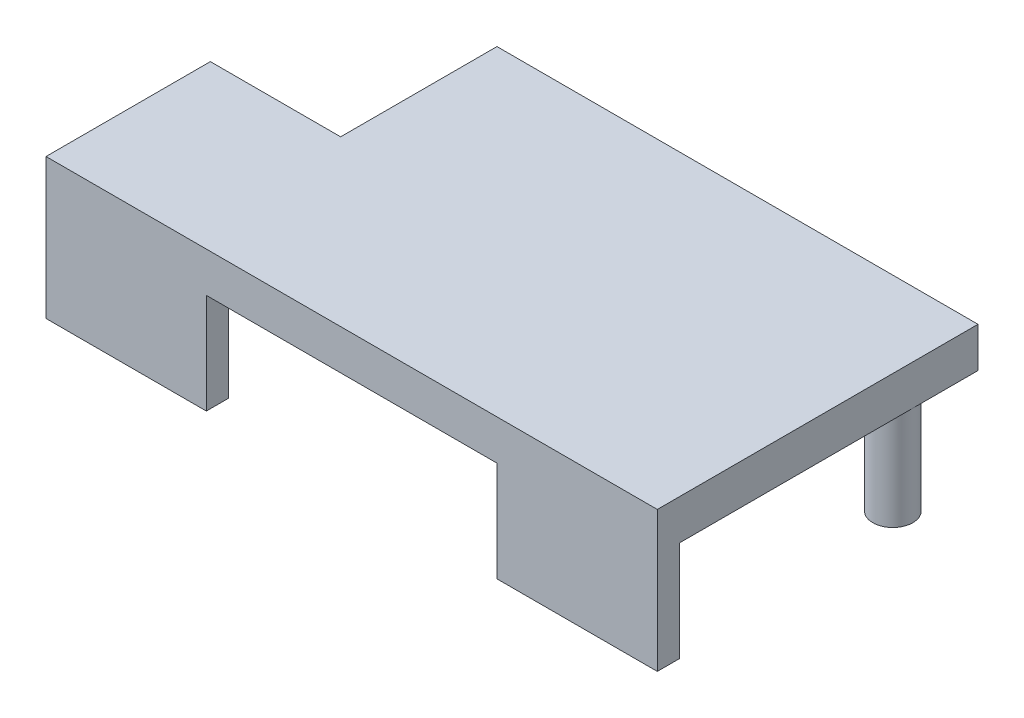
ISO-10303-21;
HEADER;
FILE_DESCRIPTION(('STEP AP214'),'2;1');
FILE_NAME('part.step','',(''),(''),'','','');
FILE_SCHEMA(('AUTOMOTIVE_DESIGN { 1 0 10303 214 1 1 1 1 }'));
ENDSEC;
DATA;
#1=APPLICATION_CONTEXT('core data for automotive mechanical design processes');
#2=APPLICATION_PROTOCOL_DEFINITION('international standard','automotive_design',2000,#1);
#3=PRODUCT_CONTEXT('',#1,'mechanical');
#4=PRODUCT('Part','Part','',(#3));
#5=PRODUCT_RELATED_PRODUCT_CATEGORY('part','',(#4));
#6=PRODUCT_DEFINITION_FORMATION('','',#4);
#7=PRODUCT_DEFINITION_CONTEXT('part definition',#1,'design');
#8=PRODUCT_DEFINITION('design','',#6,#7);
#9=PRODUCT_DEFINITION_SHAPE('','',#8);
#10=(LENGTH_UNIT() NAMED_UNIT(*) SI_UNIT(.MILLI.,.METRE.));
#11=(NAMED_UNIT(*) PLANE_ANGLE_UNIT() SI_UNIT($,.RADIAN.));
#12=(NAMED_UNIT(*) SI_UNIT($,.STERADIAN.) SOLID_ANGLE_UNIT());
#13=UNCERTAINTY_MEASURE_WITH_UNIT(LENGTH_MEASURE(1.E-05),#10,'distance_accuracy_value','');
#14=(GEOMETRIC_REPRESENTATION_CONTEXT(3) GLOBAL_UNCERTAINTY_ASSIGNED_CONTEXT((#13)) GLOBAL_UNIT_ASSIGNED_CONTEXT((#10,
#11,#12)) REPRESENTATION_CONTEXT('',''));
#15=CARTESIAN_POINT('',(0.,0.,0.));
#16=DIRECTION('',(0.,0.,1.));
#17=DIRECTION('',(1.,0.,0.));
#18=AXIS2_PLACEMENT_3D('',#15,#16,#17);
#19=CARTESIAN_POINT('',(-15.25,2.,-8.));
#20=DIRECTION('',(1.,0.,0.));
#21=DIRECTION('',(0.,0.,-1.));
#22=AXIS2_PLACEMENT_3D('',#19,#20,#21);
#23=PLANE('',#22);
#24=DIRECTION('',(0.,0.,-1.));
#25=VECTOR('',#24,1.);
#26=CARTESIAN_POINT('',(-15.25,-5.,8.));
#27=LINE('',#26,#25);
#28=CARTESIAN_POINT('',(-15.25,-5.,8.));
#29=VERTEX_POINT('',#28);
#30=CARTESIAN_POINT('',(-15.25,-5.,6.9));
#31=VERTEX_POINT('',#30);
#32=EDGE_CURVE('E156',#29,#31,#27,.T.);
#33=ORIENTED_EDGE('',*,*,#32,.F.);
#34=DIRECTION('',(0.,-1.,0.));
#35=VECTOR('',#34,1.);
#36=CARTESIAN_POINT('',(-15.25,2.,8.));
#37=LINE('',#36,#35);
#38=CARTESIAN_POINT('',(-15.25,2.,8.));
#39=VERTEX_POINT('',#38);
#40=EDGE_CURVE('E274',#39,#29,#37,.T.);
#41=ORIENTED_EDGE('',*,*,#40,.F.);
#42=DIRECTION('',(0.,0.,1.));
#43=VECTOR('',#42,1.);
#44=CARTESIAN_POINT('',(-15.25,2.,-8.));
#45=LINE('',#44,#43);
#46=CARTESIAN_POINT('',(-15.25,2.,-0.199999999999999));
#47=VERTEX_POINT('',#46);
#48=EDGE_CURVE('E252',#47,#39,#45,.T.);
#49=ORIENTED_EDGE('',*,*,#48,.F.);
#50=DIRECTION('',(0.,-1.,0.));
#51=VECTOR('',#50,1.);
#52=CARTESIAN_POINT('',(-15.25,10.,-0.199999999999999));
#53=LINE('',#52,#51);
#54=CARTESIAN_POINT('',(-15.25,0.,-0.199999999999999));
#55=VERTEX_POINT('',#54);
#56=EDGE_CURVE('E339',#47,#55,#53,.T.);
#57=ORIENTED_EDGE('',*,*,#56,.T.);
#58=DIRECTION('',(0.,0.,1.));
#59=VECTOR('',#58,1.);
#60=CARTESIAN_POINT('',(-15.25,0.,-8.));
#61=LINE('',#60,#59);
#62=CARTESIAN_POINT('',(-15.25,0.,6.9));
#63=VERTEX_POINT('',#62);
#64=EDGE_CURVE('E180',#55,#63,#61,.T.);
#65=ORIENTED_EDGE('',*,*,#64,.T.);
#66=DIRECTION('',(0.,1.,0.));
#67=VECTOR('',#66,1.);
#68=CARTESIAN_POINT('',(-15.25,-8.,6.9));
#69=LINE('',#68,#67);
#70=EDGE_CURVE('E172',#31,#63,#69,.T.);
#71=ORIENTED_EDGE('',*,*,#70,.F.);
#72=EDGE_LOOP('',(#33,#41,#49,#57,#65,#71));
#73=FACE_BOUND('',#72,.T.);
#74=ADVANCED_FACE('F45',(#73),#23,.F.);
#75=CARTESIAN_POINT('',(15.25,2.,-8.));
#76=DIRECTION('',(-1.,0.,0.));
#77=DIRECTION('',(0.,0.,1.));
#78=AXIS2_PLACEMENT_3D('',#75,#76,#77);
#79=PLANE('',#78);
#80=DIRECTION('',(0.,0.,1.));
#81=VECTOR('',#80,1.);
#82=CARTESIAN_POINT('',(15.25,-5.,8.));
#83=LINE('',#82,#81);
#84=CARTESIAN_POINT('',(15.25,-5.,6.9));
#85=VERTEX_POINT('',#84);
#86=CARTESIAN_POINT('',(15.25,-5.,8.));
#87=VERTEX_POINT('',#86);
#88=EDGE_CURVE('E176',#85,#87,#83,.T.);
#89=ORIENTED_EDGE('',*,*,#88,.F.);
#90=DIRECTION('',(0.,1.,0.));
#91=VECTOR('',#90,1.);
#92=CARTESIAN_POINT('',(15.25,-8.,6.9));
#93=LINE('',#92,#91);
#94=CARTESIAN_POINT('',(15.25,0.,6.9));
#95=VERTEX_POINT('',#94);
#96=EDGE_CURVE('E288',#85,#95,#93,.T.);
#97=ORIENTED_EDGE('',*,*,#96,.T.);
#98=DIRECTION('',(0.,0.,-1.));
#99=VECTOR('',#98,1.);
#100=CARTESIAN_POINT('',(15.25,0.,-8.));
#101=LINE('',#100,#99);
#102=CARTESIAN_POINT('',(15.25,0.,-8.));
#103=VERTEX_POINT('',#102);
#104=EDGE_CURVE('E234',#95,#103,#101,.T.);
#105=ORIENTED_EDGE('',*,*,#104,.T.);
#106=DIRECTION('',(0.,-1.,0.));
#107=VECTOR('',#106,1.);
#108=CARTESIAN_POINT('',(15.25,2.,-8.));
#109=LINE('',#108,#107);
#110=CARTESIAN_POINT('',(15.25,2.,-8.));
#111=VERTEX_POINT('',#110);
#112=EDGE_CURVE('E54',#111,#103,#109,.T.);
#113=ORIENTED_EDGE('',*,*,#112,.F.);
#114=DIRECTION('',(0.,0.,-1.));
#115=VECTOR('',#114,1.);
#116=CARTESIAN_POINT('',(15.25,2.,-8.));
#117=LINE('',#116,#115);
#118=CARTESIAN_POINT('',(15.25,2.,8.));
#119=VERTEX_POINT('',#118);
#120=EDGE_CURVE('E243',#119,#111,#117,.T.);
#121=ORIENTED_EDGE('',*,*,#120,.F.);
#122=DIRECTION('',(0.,-1.,0.));
#123=VECTOR('',#122,1.);
#124=CARTESIAN_POINT('',(15.25,2.,8.));
#125=LINE('',#124,#123);
#126=EDGE_CURVE('E258',#119,#87,#125,.T.);
#127=ORIENTED_EDGE('',*,*,#126,.T.);
#128=EDGE_LOOP('',(#89,#97,#105,#113,#121,#127));
#129=FACE_BOUND('',#128,.T.);
#130=ADVANCED_FACE('F47',(#129),#79,.F.);
#131=CARTESIAN_POINT('',(-15.25,2.,8.));
#132=DIRECTION('',(0.,0.,-1.));
#133=DIRECTION('',(-1.,0.,0.));
#134=AXIS2_PLACEMENT_3D('',#131,#132,#133);
#135=PLANE('',#134);
#136=DIRECTION('',(-1.,0.,0.));
#137=VECTOR('',#136,1.);
#138=CARTESIAN_POINT('',(-15.25,-5.,8.));
#139=LINE('',#138,#137);
#140=CARTESIAN_POINT('',(7.24999999999999,-5.,8.));
#141=VERTEX_POINT('',#140);
#142=EDGE_CURVE('E355',#87,#141,#139,.T.);
#143=ORIENTED_EDGE('',*,*,#142,.F.);
#144=ORIENTED_EDGE('',*,*,#126,.F.);
#145=DIRECTION('',(1.,0.,0.));
#146=VECTOR('',#145,1.);
#147=CARTESIAN_POINT('',(-15.25,2.,8.));
#148=LINE('',#147,#146);
#149=EDGE_CURVE('E255',#39,#119,#148,.T.);
#150=ORIENTED_EDGE('',*,*,#149,.F.);
#151=ORIENTED_EDGE('',*,*,#40,.T.);
#152=CARTESIAN_POINT('',(-7.25,-5.,8.));
#153=VERTEX_POINT('',#152);
#154=EDGE_CURVE('E159',#153,#29,#139,.T.);
#155=ORIENTED_EDGE('',*,*,#154,.F.);
#156=DIRECTION('',(0.,1.,0.));
#157=VECTOR('',#156,1.);
#158=CARTESIAN_POINT('',(-7.25,-8.,8.));
#159=LINE('',#158,#157);
#160=CARTESIAN_POINT('',(-7.25,0.,8.));
#161=VERTEX_POINT('',#160);
#162=EDGE_CURVE('E187',#153,#161,#159,.T.);
#163=ORIENTED_EDGE('',*,*,#162,.T.);
#164=DIRECTION('',(1.,0.,0.));
#165=VECTOR('',#164,1.);
#166=CARTESIAN_POINT('',(-15.25,0.,8.));
#167=LINE('',#166,#165);
#168=CARTESIAN_POINT('',(7.24999999999999,0.,8.));
#169=VERTEX_POINT('',#168);
#170=EDGE_CURVE('E248',#161,#169,#167,.T.);
#171=ORIENTED_EDGE('',*,*,#170,.T.);
#172=DIRECTION('',(0.,1.,0.));
#173=VECTOR('',#172,1.);
#174=CARTESIAN_POINT('',(7.25,-8.,8.));
#175=LINE('',#174,#173);
#176=EDGE_CURVE('E323',#141,#169,#175,.T.);
#177=ORIENTED_EDGE('',*,*,#176,.F.);
#178=EDGE_LOOP('',(#143,#144,#150,#151,#155,#163,#171,#177));
#179=FACE_BOUND('',#178,.T.);
#180=ADVANCED_FACE('F367',(#179),#135,.F.);
#181=CARTESIAN_POINT('',(14.2,-8.,-4.8));
#182=DIRECTION('',(0.,1.,0.));
#183=DIRECTION('',(0.,0.,1.));
#184=AXIS2_PLACEMENT_3D('',#181,#182,#183);
#185=CYLINDRICAL_SURFACE('',#184,1.);
#186=CARTESIAN_POINT('',(14.2,0.,-4.8));
#187=DIRECTION('',(0.,1.,0.));
#188=DIRECTION('',(0.,0.,1.));
#189=AXIS2_PLACEMENT_3D('',#186,#187,#188);
#190=CIRCLE('',#189,1.);
#191=CARTESIAN_POINT('',(14.2,0.,-3.8));
#192=VERTEX_POINT('',#191);
#193=EDGE_CURVE('E201',#192,#192,#190,.T.);
#194=ORIENTED_EDGE('',*,*,#193,.F.);
#195=EDGE_LOOP('',(#194));
#196=FACE_BOUND('',#195,.T.);
#197=CARTESIAN_POINT('',(14.2,-5.,-4.8));
#198=DIRECTION('',(0.,-1.,0.));
#199=DIRECTION('',(0.,0.,-1.));
#200=AXIS2_PLACEMENT_3D('',#197,#198,#199);
#201=CIRCLE('',#200,1.);
#202=CARTESIAN_POINT('',(14.2,-5.,-5.8));
#203=VERTEX_POINT('',#202);
#204=EDGE_CURVE('E166',#203,#203,#201,.T.);
#205=ORIENTED_EDGE('',*,*,#204,.F.);
#206=EDGE_LOOP('',(#205));
#207=FACE_BOUND('',#206,.T.);
#208=ADVANCED_FACE('F385',(#196,#207),#185,.T.);
#209=CARTESIAN_POINT('',(7.25,-8.,8.));
#210=DIRECTION('',(-1.,0.,0.));
#211=DIRECTION('',(0.,0.,1.));
#212=AXIS2_PLACEMENT_3D('',#209,#210,#211);
#213=PLANE('',#212);
#214=DIRECTION('',(0.,1.,0.));
#215=VECTOR('',#214,1.);
#216=CARTESIAN_POINT('',(7.25,-8.,6.9));
#217=LINE('',#216,#215);
#218=CARTESIAN_POINT('',(7.25,-5.,6.9));
#219=VERTEX_POINT('',#218);
#220=CARTESIAN_POINT('',(7.25,0.,6.9));
#221=VERTEX_POINT('',#220);
#222=EDGE_CURVE('E326',#219,#221,#217,.T.);
#223=ORIENTED_EDGE('',*,*,#222,.F.);
#224=DIRECTION('',(0.,0.,1.));
#225=VECTOR('',#224,1.);
#226=CARTESIAN_POINT('',(7.25,-5.,8.));
#227=LINE('',#226,#225);
#228=EDGE_CURVE('E61',#219,#141,#227,.T.);
#229=ORIENTED_EDGE('',*,*,#228,.T.);
#230=ORIENTED_EDGE('',*,*,#176,.T.);
#231=DIRECTION('',(0.,0.,1.));
#232=VECTOR('',#231,1.);
#233=CARTESIAN_POINT('',(7.25,0.,8.));
#234=LINE('',#233,#232);
#235=EDGE_CURVE('E190',#221,#169,#234,.T.);
#236=ORIENTED_EDGE('',*,*,#235,.F.);
#237=EDGE_LOOP('',(#223,#229,#230,#236));
#238=FACE_BOUND('',#237,.T.);
#239=ADVANCED_FACE('F373',(#238),#213,.T.);
#240=CARTESIAN_POINT('',(15.25,-8.,6.9));
#241=DIRECTION('',(0.,0.,-1.));
#242=DIRECTION('',(-1.,0.,0.));
#243=AXIS2_PLACEMENT_3D('',#240,#241,#242);
#244=PLANE('',#243);
#245=ORIENTED_EDGE('',*,*,#96,.F.);
#246=DIRECTION('',(1.,0.,0.));
#247=VECTOR('',#246,1.);
#248=CARTESIAN_POINT('',(-15.25,-5.,6.9));
#249=LINE('',#248,#247);
#250=EDGE_CURVE('E165',#219,#85,#249,.T.);
#251=ORIENTED_EDGE('',*,*,#250,.F.);
#252=ORIENTED_EDGE('',*,*,#222,.T.);
#253=DIRECTION('',(-1.,0.,0.));
#254=VECTOR('',#253,1.);
#255=CARTESIAN_POINT('',(15.25,0.,6.9));
#256=LINE('',#255,#254);
#257=EDGE_CURVE('E183',#95,#221,#256,.T.);
#258=ORIENTED_EDGE('',*,*,#257,.F.);
#259=EDGE_LOOP('',(#245,#251,#252,#258));
#260=FACE_BOUND('',#259,.T.);
#261=ADVANCED_FACE('F375',(#260),#244,.T.);
#262=CARTESIAN_POINT('',(-15.25,-8.,6.9));
#263=DIRECTION('',(0.,0.,-1.));
#264=DIRECTION('',(-1.,0.,0.));
#265=AXIS2_PLACEMENT_3D('',#262,#263,#264);
#266=PLANE('',#265);
#267=DIRECTION('',(0.,1.,0.));
#268=VECTOR('',#267,1.);
#269=CARTESIAN_POINT('',(-7.25,-8.,6.9));
#270=LINE('',#269,#268);
#271=CARTESIAN_POINT('',(-7.25,-5.,6.9));
#272=VERTEX_POINT('',#271);
#273=CARTESIAN_POINT('',(-7.25,0.,6.9));
#274=VERTEX_POINT('',#273);
#275=EDGE_CURVE('E174',#272,#274,#270,.T.);
#276=ORIENTED_EDGE('',*,*,#275,.F.);
#277=EDGE_CURVE('E69',#31,#272,#249,.T.);
#278=ORIENTED_EDGE('',*,*,#277,.F.);
#279=ORIENTED_EDGE('',*,*,#70,.T.);
#280=DIRECTION('',(-1.,0.,0.));
#281=VECTOR('',#280,1.);
#282=CARTESIAN_POINT('',(-15.25,0.,6.9));
#283=LINE('',#282,#281);
#284=EDGE_CURVE('E194',#274,#63,#283,.T.);
#285=ORIENTED_EDGE('',*,*,#284,.F.);
#286=EDGE_LOOP('',(#276,#278,#279,#285));
#287=FACE_BOUND('',#286,.T.);
#288=ADVANCED_FACE('F170',(#287),#266,.T.);
#289=CARTESIAN_POINT('',(-7.25,-8.,8.));
#290=DIRECTION('',(1.,0.,0.));
#291=DIRECTION('',(0.,0.,-1.));
#292=AXIS2_PLACEMENT_3D('',#289,#290,#291);
#293=PLANE('',#292);
#294=ORIENTED_EDGE('',*,*,#162,.F.);
#295=DIRECTION('',(0.,0.,-1.));
#296=VECTOR('',#295,1.);
#297=CARTESIAN_POINT('',(-7.25,-5.,8.));
#298=LINE('',#297,#296);
#299=EDGE_CURVE('E11',#153,#272,#298,.T.);
#300=ORIENTED_EDGE('',*,*,#299,.T.);
#301=ORIENTED_EDGE('',*,*,#275,.T.);
#302=DIRECTION('',(0.,0.,-1.));
#303=VECTOR('',#302,1.);
#304=CARTESIAN_POINT('',(-7.25,0.,8.));
#305=LINE('',#304,#303);
#306=EDGE_CURVE('E197',#161,#274,#305,.T.);
#307=ORIENTED_EDGE('',*,*,#306,.F.);
#308=EDGE_LOOP('',(#294,#300,#301,#307));
#309=FACE_BOUND('',#308,.T.);
#310=ADVANCED_FACE('F383',(#309),#293,.T.);
#311=CARTESIAN_POINT('',(-15.25,2.,-8.));
#312=DIRECTION('',(0.,0.,1.));
#313=DIRECTION('',(1.,0.,0.));
#314=AXIS2_PLACEMENT_3D('',#311,#312,#313);
#315=PLANE('',#314);
#316=DIRECTION('',(0.,-1.,0.));
#317=VECTOR('',#316,1.);
#318=CARTESIAN_POINT('',(-8.75,10.,-8.));
#319=LINE('',#318,#317);
#320=CARTESIAN_POINT('',(-8.75,2.,-8.));
#321=VERTEX_POINT('',#320);
#322=CARTESIAN_POINT('',(-8.75,0.,-8.));
#323=VERTEX_POINT('',#322);
#324=EDGE_CURVE('E345',#321,#323,#319,.T.);
#325=ORIENTED_EDGE('',*,*,#324,.F.);
#326=DIRECTION('',(-1.,0.,0.));
#327=VECTOR('',#326,1.);
#328=CARTESIAN_POINT('',(-15.25,2.,-8.));
#329=LINE('',#328,#327);
#330=EDGE_CURVE('E247',#111,#321,#329,.T.);
#331=ORIENTED_EDGE('',*,*,#330,.F.);
#332=ORIENTED_EDGE('',*,*,#112,.T.);
#333=DIRECTION('',(-1.,0.,0.));
#334=VECTOR('',#333,1.);
#335=CARTESIAN_POINT('',(-15.25,0.,-8.));
#336=LINE('',#335,#334);
#337=CARTESIAN_POINT('',(-2.8,0.,-8.));
#338=VERTEX_POINT('',#337);
#339=EDGE_CURVE('E262',#103,#338,#336,.T.);
#340=ORIENTED_EDGE('',*,*,#339,.T.);
#341=DIRECTION('',(0.,1.,0.));
#342=VECTOR('',#341,1.);
#343=CARTESIAN_POINT('',(-2.8,-8.,-8.));
#344=LINE('',#343,#342);
#345=CARTESIAN_POINT('',(-2.8,-8.,-8.));
#346=VERTEX_POINT('',#345);
#347=EDGE_CURVE('E235',#346,#338,#344,.T.);
#348=ORIENTED_EDGE('',*,*,#347,.F.);
#349=DIRECTION('',(-1.,0.,0.));
#350=VECTOR('',#349,1.);
#351=CARTESIAN_POINT('',(-5.7,-8.,-8.));
#352=LINE('',#351,#350);
#353=CARTESIAN_POINT('',(-5.7,-8.,-8.));
#354=VERTEX_POINT('',#353);
#355=EDGE_CURVE('E215',#346,#354,#352,.T.);
#356=ORIENTED_EDGE('',*,*,#355,.T.);
#357=DIRECTION('',(0.,1.,0.));
#358=VECTOR('',#357,1.);
#359=CARTESIAN_POINT('',(-5.7,-8.,-8.));
#360=LINE('',#359,#358);
#361=CARTESIAN_POINT('',(-5.7,0.,-8.));
#362=VERTEX_POINT('',#361);
#363=EDGE_CURVE('E231',#354,#362,#360,.T.);
#364=ORIENTED_EDGE('',*,*,#363,.T.);
#365=EDGE_CURVE('E261',#362,#323,#336,.T.);
#366=ORIENTED_EDGE('',*,*,#365,.T.);
#367=EDGE_LOOP('',(#325,#331,#332,#340,#348,#356,#364,#366));
#368=FACE_BOUND('',#367,.T.);
#369=ADVANCED_FACE('F281',(#368),#315,.F.);
#370=CARTESIAN_POINT('',(0.,2.,0.));
#371=DIRECTION('',(0.,1.,0.));
#372=DIRECTION('',(0.,0.,1.));
#373=AXIS2_PLACEMENT_3D('',#370,#371,#372);
#374=PLANE('',#373);
#375=DIRECTION('',(0.,0.,1.));
#376=VECTOR('',#375,1.);
#377=CARTESIAN_POINT('',(-8.75,2.,0.));
#378=LINE('',#377,#376);
#379=CARTESIAN_POINT('',(-8.75,2.,-0.199999999999999));
#380=VERTEX_POINT('',#379);
#381=EDGE_CURVE('E335',#321,#380,#378,.T.);
#382=ORIENTED_EDGE('',*,*,#381,.T.);
#383=DIRECTION('',(-1.,0.,0.));
#384=VECTOR('',#383,1.);
#385=CARTESIAN_POINT('',(0.,2.,-0.199999999999999));
#386=LINE('',#385,#384);
#387=EDGE_CURVE('E327',#380,#47,#386,.T.);
#388=ORIENTED_EDGE('',*,*,#387,.T.);
#389=ORIENTED_EDGE('',*,*,#48,.T.);
#390=ORIENTED_EDGE('',*,*,#149,.T.);
#391=ORIENTED_EDGE('',*,*,#120,.T.);
#392=ORIENTED_EDGE('',*,*,#330,.T.);
#393=EDGE_LOOP('',(#382,#388,#389,#390,#391,#392));
#394=FACE_BOUND('',#393,.T.);
#395=ADVANCED_FACE('F397',(#394),#374,.T.);
#396=CARTESIAN_POINT('',(0.,0.,0.));
#397=DIRECTION('',(0.,1.,0.));
#398=DIRECTION('',(0.,0.,1.));
#399=AXIS2_PLACEMENT_3D('',#396,#397,#398);
#400=PLANE('',#399);
#401=ORIENTED_EDGE('',*,*,#193,.T.);
#402=EDGE_LOOP('',(#401));
#403=FACE_BOUND('',#402,.T.);
#404=DIRECTION('',(1.,0.,0.));
#405=VECTOR('',#404,1.);
#406=CARTESIAN_POINT('',(-15.25,0.,-0.199999999999999));
#407=LINE('',#406,#405);
#408=CARTESIAN_POINT('',(-8.75,0.,-0.199999999999999));
#409=VERTEX_POINT('',#408);
#410=EDGE_CURVE('E350',#55,#409,#407,.T.);
#411=ORIENTED_EDGE('',*,*,#410,.T.);
#412=DIRECTION('',(0.,0.,-1.));
#413=VECTOR('',#412,1.);
#414=CARTESIAN_POINT('',(-8.75,0.,-8.));
#415=LINE('',#414,#413);
#416=EDGE_CURVE('E310',#409,#323,#415,.T.);
#417=ORIENTED_EDGE('',*,*,#416,.T.);
#418=ORIENTED_EDGE('',*,*,#365,.F.);
#419=DIRECTION('',(0.,0.,1.));
#420=VECTOR('',#419,1.);
#421=CARTESIAN_POINT('',(-5.7,0.,-8.));
#422=LINE('',#421,#420);
#423=CARTESIAN_POINT('',(-5.7,0.,-5.2));
#424=VERTEX_POINT('',#423);
#425=EDGE_CURVE('E220',#362,#424,#422,.T.);
#426=ORIENTED_EDGE('',*,*,#425,.T.);
#427=DIRECTION('',(1.,0.,0.));
#428=VECTOR('',#427,1.);
#429=CARTESIAN_POINT('',(-5.7,0.,-5.2));
#430=LINE('',#429,#428);
#431=CARTESIAN_POINT('',(-2.8,0.,-5.2));
#432=VERTEX_POINT('',#431);
#433=EDGE_CURVE('E224',#424,#432,#430,.T.);
#434=ORIENTED_EDGE('',*,*,#433,.T.);
#435=DIRECTION('',(0.,0.,-1.));
#436=VECTOR('',#435,1.);
#437=CARTESIAN_POINT('',(-2.8,0.,-8.));
#438=LINE('',#437,#436);
#439=EDGE_CURVE('E207',#432,#338,#438,.T.);
#440=ORIENTED_EDGE('',*,*,#439,.T.);
#441=ORIENTED_EDGE('',*,*,#339,.F.);
#442=ORIENTED_EDGE('',*,*,#104,.F.);
#443=ORIENTED_EDGE('',*,*,#257,.T.);
#444=ORIENTED_EDGE('',*,*,#235,.T.);
#445=ORIENTED_EDGE('',*,*,#170,.F.);
#446=ORIENTED_EDGE('',*,*,#306,.T.);
#447=ORIENTED_EDGE('',*,*,#284,.T.);
#448=ORIENTED_EDGE('',*,*,#64,.F.);
#449=EDGE_LOOP('',(#411,#417,#418,#426,#434,#440,#441,#442,#443,#444,#445,#446,#447,#448));
#450=FACE_BOUND('',#449,.T.);
#451=ADVANCED_FACE('F292',(#403,#450),#400,.F.);
#452=CARTESIAN_POINT('',(-5.7,-8.,-8.));
#453=DIRECTION('',(-1.,0.,0.));
#454=DIRECTION('',(0.,0.,1.));
#455=AXIS2_PLACEMENT_3D('',#452,#453,#454);
#456=PLANE('',#455);
#457=ORIENTED_EDGE('',*,*,#425,.F.);
#458=ORIENTED_EDGE('',*,*,#363,.F.);
#459=DIRECTION('',(0.,0.,1.));
#460=VECTOR('',#459,1.);
#461=CARTESIAN_POINT('',(-5.7,-8.,-8.));
#462=LINE('',#461,#460);
#463=CARTESIAN_POINT('',(-5.7,-8.,-5.2));
#464=VERTEX_POINT('',#463);
#465=EDGE_CURVE('E202',#354,#464,#462,.T.);
#466=ORIENTED_EDGE('',*,*,#465,.T.);
#467=DIRECTION('',(0.,1.,0.));
#468=VECTOR('',#467,1.);
#469=CARTESIAN_POINT('',(-5.7,-8.,-5.2));
#470=LINE('',#469,#468);
#471=EDGE_CURVE('E219',#464,#424,#470,.T.);
#472=ORIENTED_EDGE('',*,*,#471,.T.);
#473=EDGE_LOOP('',(#457,#458,#466,#472));
#474=FACE_BOUND('',#473,.T.);
#475=ADVANCED_FACE('F306',(#474),#456,.T.);
#476=CARTESIAN_POINT('',(-2.8,-8.,-8.));
#477=DIRECTION('',(1.,0.,0.));
#478=DIRECTION('',(0.,0.,-1.));
#479=AXIS2_PLACEMENT_3D('',#476,#477,#478);
#480=PLANE('',#479);
#481=ORIENTED_EDGE('',*,*,#439,.F.);
#482=DIRECTION('',(0.,1.,0.));
#483=VECTOR('',#482,1.);
#484=CARTESIAN_POINT('',(-2.8,-8.,-5.2));
#485=LINE('',#484,#483);
#486=CARTESIAN_POINT('',(-2.8,-8.,-5.2));
#487=VERTEX_POINT('',#486);
#488=EDGE_CURVE('E238',#487,#432,#485,.T.);
#489=ORIENTED_EDGE('',*,*,#488,.F.);
#490=DIRECTION('',(0.,0.,-1.));
#491=VECTOR('',#490,1.);
#492=CARTESIAN_POINT('',(-2.8,-8.,-8.));
#493=LINE('',#492,#491);
#494=EDGE_CURVE('E211',#487,#346,#493,.T.);
#495=ORIENTED_EDGE('',*,*,#494,.T.);
#496=ORIENTED_EDGE('',*,*,#347,.T.);
#497=EDGE_LOOP('',(#481,#489,#495,#496));
#498=FACE_BOUND('',#497,.T.);
#499=ADVANCED_FACE('F296',(#498),#480,.T.);
#500=CARTESIAN_POINT('',(-5.7,-8.,-5.2));
#501=DIRECTION('',(0.,0.,1.));
#502=DIRECTION('',(1.,0.,0.));
#503=AXIS2_PLACEMENT_3D('',#500,#501,#502);
#504=PLANE('',#503);
#505=ORIENTED_EDGE('',*,*,#433,.F.);
#506=ORIENTED_EDGE('',*,*,#471,.F.);
#507=DIRECTION('',(1.,0.,0.));
#508=VECTOR('',#507,1.);
#509=CARTESIAN_POINT('',(-5.7,-8.,-5.2));
#510=LINE('',#509,#508);
#511=EDGE_CURVE('E206',#464,#487,#510,.T.);
#512=ORIENTED_EDGE('',*,*,#511,.T.);
#513=ORIENTED_EDGE('',*,*,#488,.T.);
#514=EDGE_LOOP('',(#505,#506,#512,#513));
#515=FACE_BOUND('',#514,.T.);
#516=ADVANCED_FACE('F414',(#515),#504,.T.);
#517=CARTESIAN_POINT('',(0.,-8.,0.));
#518=DIRECTION('',(0.,1.,0.));
#519=DIRECTION('',(0.,0.,1.));
#520=AXIS2_PLACEMENT_3D('',#517,#518,#519);
#521=PLANE('',#520);
#522=ORIENTED_EDGE('',*,*,#465,.F.);
#523=ORIENTED_EDGE('',*,*,#355,.F.);
#524=ORIENTED_EDGE('',*,*,#494,.F.);
#525=ORIENTED_EDGE('',*,*,#511,.F.);
#526=EDGE_LOOP('',(#522,#523,#524,#525));
#527=FACE_BOUND('',#526,.T.);
#528=ADVANCED_FACE('F303',(#527),#521,.F.);
#529=CARTESIAN_POINT('',(-15.25,10.,-0.199999999999999));
#530=DIRECTION('',(0.,0.,-1.));
#531=DIRECTION('',(-1.,0.,0.));
#532=AXIS2_PLACEMENT_3D('',#529,#530,#531);
#533=PLANE('',#532);
#534=DIRECTION('',(0.,-1.,0.));
#535=VECTOR('',#534,1.);
#536=CARTESIAN_POINT('',(-8.75,10.,-0.199999999999999));
#537=LINE('',#536,#535);
#538=EDGE_CURVE('E342',#380,#409,#537,.T.);
#539=ORIENTED_EDGE('',*,*,#538,.T.);
#540=ORIENTED_EDGE('',*,*,#410,.F.);
#541=ORIENTED_EDGE('',*,*,#56,.F.);
#542=ORIENTED_EDGE('',*,*,#387,.F.);
#543=EDGE_LOOP('',(#539,#540,#541,#542));
#544=FACE_BOUND('',#543,.T.);
#545=ADVANCED_FACE('F413',(#544),#533,.T.);
#546=CARTESIAN_POINT('',(-8.75,10.,-8.));
#547=DIRECTION('',(-1.,0.,0.));
#548=DIRECTION('',(0.,0.,1.));
#549=AXIS2_PLACEMENT_3D('',#546,#547,#548);
#550=PLANE('',#549);
#551=ORIENTED_EDGE('',*,*,#324,.T.);
#552=ORIENTED_EDGE('',*,*,#416,.F.);
#553=ORIENTED_EDGE('',*,*,#538,.F.);
#554=ORIENTED_EDGE('',*,*,#381,.F.);
#555=EDGE_LOOP('',(#551,#552,#553,#554));
#556=FACE_BOUND('',#555,.T.);
#557=ADVANCED_FACE('F440',(#556),#550,.T.);
#558=CARTESIAN_POINT('',(0.,-5.,0.));
#559=DIRECTION('',(0.,-1.,0.));
#560=DIRECTION('',(0.,0.,-1.));
#561=AXIS2_PLACEMENT_3D('',#558,#559,#560);
#562=PLANE('',#561);
#563=ORIENTED_EDGE('',*,*,#154,.T.);
#564=ORIENTED_EDGE('',*,*,#32,.T.);
#565=ORIENTED_EDGE('',*,*,#277,.T.);
#566=ORIENTED_EDGE('',*,*,#299,.F.);
#567=EDGE_LOOP('',(#563,#564,#565,#566));
#568=FACE_BOUND('',#567,.T.);
#569=ADVANCED_FACE('F157',(#568),#562,.T.);
#570=ORIENTED_EDGE('',*,*,#250,.T.);
#571=ORIENTED_EDGE('',*,*,#88,.T.);
#572=ORIENTED_EDGE('',*,*,#142,.T.);
#573=ORIENTED_EDGE('',*,*,#228,.F.);
#574=EDGE_LOOP('',(#570,#571,#572,#573));
#575=FACE_BOUND('',#574,.T.);
#576=ADVANCED_FACE('F364',(#575),#562,.T.);
#577=CARTESIAN_POINT('',(14.2,-5.,-4.8));
#578=DIRECTION('',(0.,-1.,0.));
#579=DIRECTION('',(0.,0.,-1.));
#580=AXIS2_PLACEMENT_3D('',#577,#578,#579);
#581=PLANE('',#580);
#582=ORIENTED_EDGE('',*,*,#204,.T.);
#583=EDGE_LOOP('',(#582));
#584=FACE_BOUND('',#583,.T.);
#585=ADVANCED_FACE('F432',(#584),#581,.T.);
#586=CLOSED_SHELL('',(#74,#130,#180,#208,#239,#261,#288,#310,#369,#395,#451,#475,#499,#516,#528,
#545,#557,#569,#576,#585));
#587=MANIFOLD_SOLID_BREP('B2',#586);
#588=ADVANCED_BREP_SHAPE_REPRESENTATION('',(#18,#587),#14);
#589=SHAPE_DEFINITION_REPRESENTATION(#9,#588);
ENDSEC;
END-ISO-10303-21;
